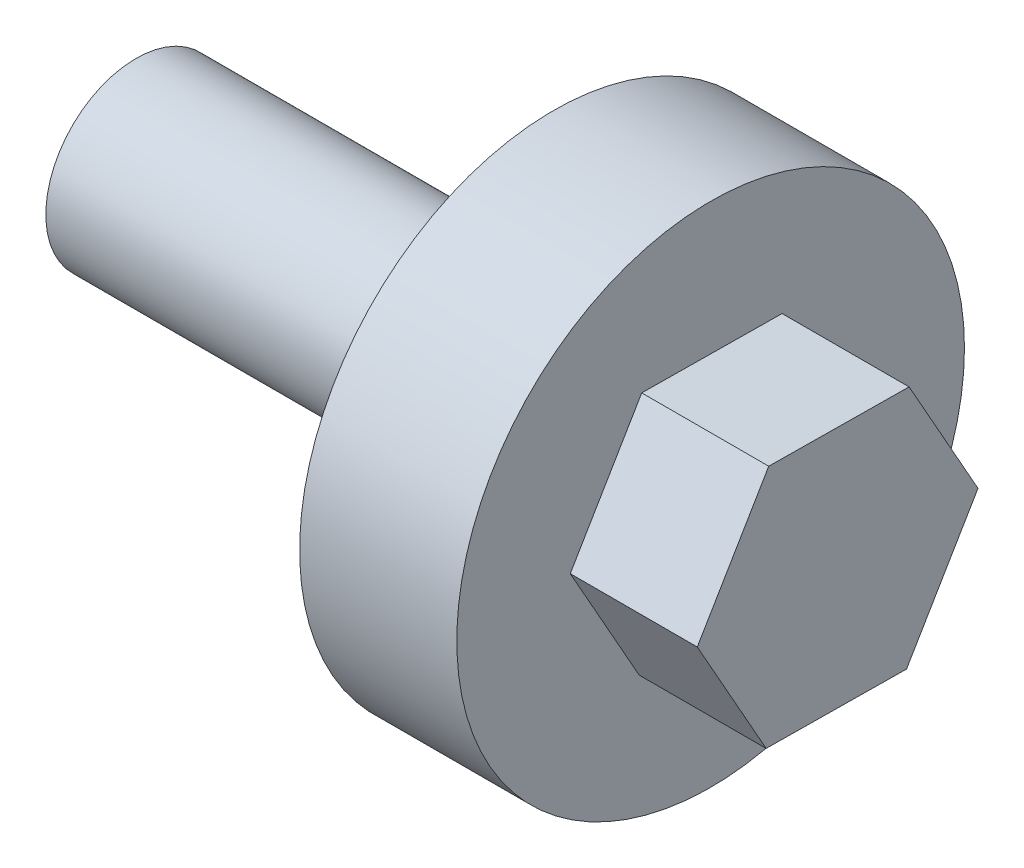
ISO-10303-21;
HEADER;
FILE_DESCRIPTION(('STEP AP214'),'2;1');
FILE_NAME('part.step','',(''),(''),'','','');
FILE_SCHEMA(('AUTOMOTIVE_DESIGN { 1 0 10303 214 1 1 1 1 }'));
ENDSEC;
DATA;
#1=APPLICATION_CONTEXT('core data for automotive mechanical design processes');
#2=APPLICATION_PROTOCOL_DEFINITION('international standard','automotive_design',2000,#1);
#3=PRODUCT_CONTEXT('',#1,'mechanical');
#4=PRODUCT('Part','Part','',(#3));
#5=PRODUCT_RELATED_PRODUCT_CATEGORY('part','',(#4));
#6=PRODUCT_DEFINITION_FORMATION('','',#4);
#7=PRODUCT_DEFINITION_CONTEXT('part definition',#1,'design');
#8=PRODUCT_DEFINITION('design','',#6,#7);
#9=PRODUCT_DEFINITION_SHAPE('','',#8);
#10=(LENGTH_UNIT() NAMED_UNIT(*) SI_UNIT(.MILLI.,.METRE.));
#11=(NAMED_UNIT(*) PLANE_ANGLE_UNIT() SI_UNIT($,.RADIAN.));
#12=(NAMED_UNIT(*) SI_UNIT($,.STERADIAN.) SOLID_ANGLE_UNIT());
#13=UNCERTAINTY_MEASURE_WITH_UNIT(LENGTH_MEASURE(1.E-05),#10,'distance_accuracy_value','');
#14=(GEOMETRIC_REPRESENTATION_CONTEXT(3) GLOBAL_UNCERTAINTY_ASSIGNED_CONTEXT((#13)) GLOBAL_UNIT_ASSIGNED_CONTEXT((#10,
#11,#12)) REPRESENTATION_CONTEXT('',''));
#15=CARTESIAN_POINT('',(0.,0.,0.));
#16=DIRECTION('',(0.,0.,1.));
#17=DIRECTION('',(1.,0.,0.));
#18=AXIS2_PLACEMENT_3D('',#15,#16,#17);
#19=CARTESIAN_POINT('',(0.,661.049224,75.529694));
#20=DIRECTION('',(1.,0.,0.));
#21=DIRECTION('',(0.,0.,-1.));
#22=AXIS2_PLACEMENT_3D('',#19,#20,#21);
#23=PLANE('',#22);
#24=CARTESIAN_POINT('',(0.,661.049224,75.529694));
#25=DIRECTION('',(1.,0.,0.));
#26=DIRECTION('',(0.,0.,-1.));
#27=AXIS2_PLACEMENT_3D('',#24,#25,#26);
#28=CIRCLE('',#27,46.334426);
#29=CARTESIAN_POINT('',(0.,661.049224,29.195268));
#30=VERTEX_POINT('',#29);
#31=EDGE_CURVE('E138',#30,#30,#28,.T.);
#32=ORIENTED_EDGE('',*,*,#31,.F.);
#33=EDGE_LOOP('',(#32));
#34=FACE_BOUND('',#33,.T.);
#35=CARTESIAN_POINT('',(0.,661.049224,75.529694));
#36=DIRECTION('',(1.,0.,0.));
#37=DIRECTION('',(0.,0.,-1.));
#38=AXIS2_PLACEMENT_3D('',#35,#36,#37);
#39=CIRCLE('',#38,16.4605447378752);
#40=CARTESIAN_POINT('',(0.,661.049224,59.0691492621248));
#41=VERTEX_POINT('',#40);
#42=EDGE_CURVE('E11',#41,#41,#39,.F.);
#43=ORIENTED_EDGE('',*,*,#42,.F.);
#44=EDGE_LOOP('',(#43));
#45=FACE_BOUND('',#44,.T.);
#46=ADVANCED_FACE('F33',(#34,#45),#23,.F.);
#47=CARTESIAN_POINT('',(28.68422,661.049224,75.529694));
#48=DIRECTION('',(1.,0.,0.));
#49=DIRECTION('',(0.,0.,-1.));
#50=AXIS2_PLACEMENT_3D('',#47,#48,#49);
#51=PLANE('',#50);
#52=CARTESIAN_POINT('',(28.68422,661.049224,75.529694));
#53=DIRECTION('',(1.,0.,0.));
#54=DIRECTION('',(0.,0.,-1.));
#55=AXIS2_PLACEMENT_3D('',#52,#53,#54);
#56=CIRCLE('',#55,46.334426);
#57=CARTESIAN_POINT('',(28.68422,661.049224,29.195268));
#58=VERTEX_POINT('',#57);
#59=EDGE_CURVE('E41',#58,#58,#56,.T.);
#60=ORIENTED_EDGE('',*,*,#59,.T.);
#61=EDGE_LOOP('',(#60));
#62=FACE_BOUND('',#61,.T.);
#63=DIRECTION('',(0.,-0.87124137043839,-0.49085484049425));
#64=VECTOR('',#63,1.);
#65=CARTESIAN_POINT('',(28.68422,661.318972,101.15042));
#66=LINE('',#65,#64);
#67=CARTESIAN_POINT('',(28.68422,661.318972,101.15042));
#68=VERTEX_POINT('',#67);
#69=CARTESIAN_POINT('',(28.68422,638.9958984206,88.57366562062));
#70=VERTEX_POINT('',#69);
#71=EDGE_CURVE('E120',#68,#70,#66,.T.);
#72=ORIENTED_EDGE('',*,*,#71,.F.);
#73=DIRECTION('',(0.,-0.860713446657774,0.509089739380489));
#74=VECTOR('',#73,1.);
#75=CARTESIAN_POINT('',(28.68422,683.372297579401,88.1064483793799));
#76=LINE('',#75,#74);
#77=CARTESIAN_POINT('',(28.68422,683.372297579401,88.1064483793799));
#78=VERTEX_POINT('',#77);
#79=EDGE_CURVE('E117',#78,#68,#76,.T.);
#80=ORIENTED_EDGE('',*,*,#79,.F.);
#81=DIRECTION('',(0.,0.0105279237806167,0.99994457987474));
#82=VECTOR('',#81,1.);
#83=CARTESIAN_POINT('',(28.68422,683.1025495794,62.4857223793799));
#84=LINE('',#83,#82);
#85=CARTESIAN_POINT('',(28.68422,683.1025495794,62.4857223793799));
#86=VERTEX_POINT('',#85);
#87=EDGE_CURVE('E76',#86,#78,#84,.T.);
#88=ORIENTED_EDGE('',*,*,#87,.F.);
#89=DIRECTION('',(0.,0.871241370438395,0.490854840494243));
#90=VECTOR('',#89,1.);
#91=CARTESIAN_POINT('',(28.68422,660.779476,49.9089680000001));
#92=LINE('',#91,#90);
#93=CARTESIAN_POINT('',(28.68422,660.779476,49.9089680000001));
#94=VERTEX_POINT('',#93);
#95=EDGE_CURVE('E126',#94,#86,#92,.T.);
#96=ORIENTED_EDGE('',*,*,#95,.F.);
#97=DIRECTION('',(0.,0.860713446657775,-0.509089739380488));
#98=VECTOR('',#97,1.);
#99=CARTESIAN_POINT('',(28.68422,638.726150420599,62.9529396206201));
#100=LINE('',#99,#98);
#101=CARTESIAN_POINT('',(28.68422,638.726150420599,62.9529396206201));
#102=VERTEX_POINT('',#101);
#103=EDGE_CURVE('E106',#102,#94,#100,.T.);
#104=ORIENTED_EDGE('',*,*,#103,.F.);
#105=DIRECTION('',(0.,-0.0105279237806211,-0.99994457987474));
#106=VECTOR('',#105,1.);
#107=CARTESIAN_POINT('',(28.68422,638.9958984206,88.57366562062));
#108=LINE('',#107,#106);
#109=EDGE_CURVE('E123',#70,#102,#108,.T.);
#110=ORIENTED_EDGE('',*,*,#109,.F.);
#111=EDGE_LOOP('',(#72,#80,#88,#96,#104,#110));
#112=FACE_BOUND('',#111,.T.);
#113=ADVANCED_FACE('F146',(#62,#112),#51,.T.);
#114=CARTESIAN_POINT('',(28.68422,661.049224,75.529694));
#115=DIRECTION('',(-1.,0.,0.));
#116=DIRECTION('',(0.,0.,1.));
#117=AXIS2_PLACEMENT_3D('',#114,#115,#116);
#118=CYLINDRICAL_SURFACE('',#117,46.334426);
#119=ORIENTED_EDGE('',*,*,#59,.F.);
#120=EDGE_LOOP('',(#119));
#121=FACE_BOUND('',#120,.T.);
#122=ORIENTED_EDGE('',*,*,#31,.T.);
#123=EDGE_LOOP('',(#122));
#124=FACE_BOUND('',#123,.T.);
#125=ADVANCED_FACE('F35',(#121,#124),#118,.T.);
#126=CARTESIAN_POINT('',(51.8668,683.372297579401,88.1064483793799));
#127=DIRECTION('',(0.,-0.509089739380489,-0.860713446657774));
#128=DIRECTION('',(0.,0.860713446657775,-0.509089739380489));
#129=AXIS2_PLACEMENT_3D('',#126,#127,#128);
#130=PLANE('',#129);
#131=ORIENTED_EDGE('',*,*,#79,.T.);
#132=DIRECTION('',(-1.,0.,0.));
#133=VECTOR('',#132,1.);
#134=CARTESIAN_POINT('',(51.8668,661.318972,101.15042));
#135=LINE('',#134,#133);
#136=CARTESIAN_POINT('',(51.8668,661.318972,101.15042));
#137=VERTEX_POINT('',#136);
#138=EDGE_CURVE('E136',#137,#68,#135,.T.);
#139=ORIENTED_EDGE('',*,*,#138,.F.);
#140=DIRECTION('',(0.,-0.860713446657774,0.509089739380489));
#141=VECTOR('',#140,1.);
#142=CARTESIAN_POINT('',(51.8668,683.372297579401,88.1064483793799));
#143=LINE('',#142,#141);
#144=CARTESIAN_POINT('',(51.8668,683.372297579401,88.1064483793799));
#145=VERTEX_POINT('',#144);
#146=EDGE_CURVE('E129',#145,#137,#143,.T.);
#147=ORIENTED_EDGE('',*,*,#146,.F.);
#148=DIRECTION('',(-1.,0.,0.));
#149=VECTOR('',#148,1.);
#150=CARTESIAN_POINT('',(51.8668,683.372297579401,88.1064483793799));
#151=LINE('',#150,#149);
#152=EDGE_CURVE('E113',#145,#78,#151,.T.);
#153=ORIENTED_EDGE('',*,*,#152,.T.);
#154=EDGE_LOOP('',(#131,#139,#147,#153));
#155=FACE_BOUND('',#154,.T.);
#156=ADVANCED_FACE('F177',(#155),#130,.F.);
#157=CARTESIAN_POINT('',(51.8668,661.318972,101.15042));
#158=DIRECTION('',(0.,0.49085484049425,-0.87124137043839));
#159=DIRECTION('',(0.,0.87124137043839,0.49085484049425));
#160=AXIS2_PLACEMENT_3D('',#157,#158,#159);
#161=PLANE('',#160);
#162=ORIENTED_EDGE('',*,*,#71,.T.);
#163=DIRECTION('',(-1.,0.,0.));
#164=VECTOR('',#163,1.);
#165=CARTESIAN_POINT('',(51.8668,638.9958984206,88.57366562062));
#166=LINE('',#165,#164);
#167=CARTESIAN_POINT('',(51.8668,638.9958984206,88.57366562062));
#168=VERTEX_POINT('',#167);
#169=EDGE_CURVE('E133',#168,#70,#166,.T.);
#170=ORIENTED_EDGE('',*,*,#169,.F.);
#171=DIRECTION('',(0.,-0.87124137043839,-0.49085484049425));
#172=VECTOR('',#171,1.);
#173=CARTESIAN_POINT('',(51.8668,661.318972,101.15042));
#174=LINE('',#173,#172);
#175=EDGE_CURVE('E84',#137,#168,#174,.T.);
#176=ORIENTED_EDGE('',*,*,#175,.F.);
#177=ORIENTED_EDGE('',*,*,#138,.T.);
#178=EDGE_LOOP('',(#162,#170,#176,#177));
#179=FACE_BOUND('',#178,.T.);
#180=ADVANCED_FACE('F173',(#179),#161,.F.);
#181=CARTESIAN_POINT('',(51.8668,638.9958984206,88.57366562062));
#182=DIRECTION('',(0.,0.999944579874739,-0.0105279237806211));
#183=DIRECTION('',(0.,0.0105279237806211,0.99994457987474));
#184=AXIS2_PLACEMENT_3D('',#181,#182,#183);
#185=PLANE('',#184);
#186=ORIENTED_EDGE('',*,*,#109,.T.);
#187=DIRECTION('',(-1.,0.,0.));
#188=VECTOR('',#187,1.);
#189=CARTESIAN_POINT('',(51.8668,638.726150420599,62.9529396206201));
#190=LINE('',#189,#188);
#191=CARTESIAN_POINT('',(51.8668,638.726150420599,62.9529396206201));
#192=VERTEX_POINT('',#191);
#193=EDGE_CURVE('E109',#192,#102,#190,.T.);
#194=ORIENTED_EDGE('',*,*,#193,.F.);
#195=DIRECTION('',(0.,-0.0105279237806211,-0.99994457987474));
#196=VECTOR('',#195,1.);
#197=CARTESIAN_POINT('',(51.8668,638.9958984206,88.57366562062));
#198=LINE('',#197,#196);
#199=EDGE_CURVE('E97',#168,#192,#198,.T.);
#200=ORIENTED_EDGE('',*,*,#199,.F.);
#201=ORIENTED_EDGE('',*,*,#169,.T.);
#202=EDGE_LOOP('',(#186,#194,#200,#201));
#203=FACE_BOUND('',#202,.T.);
#204=ADVANCED_FACE('F170',(#203),#185,.F.);
#205=CARTESIAN_POINT('',(51.8668,638.726150420599,62.9529396206201));
#206=DIRECTION('',(0.,0.509089739380488,0.860713446657775));
#207=DIRECTION('',(0.,-0.860713446657775,0.509089739380488));
#208=AXIS2_PLACEMENT_3D('',#205,#206,#207);
#209=PLANE('',#208);
#210=ORIENTED_EDGE('',*,*,#103,.T.);
#211=DIRECTION('',(-1.,0.,0.));
#212=VECTOR('',#211,1.);
#213=CARTESIAN_POINT('',(51.8668,660.779476,49.9089680000001));
#214=LINE('',#213,#212);
#215=CARTESIAN_POINT('',(51.8668,660.779476,49.9089680000001));
#216=VERTEX_POINT('',#215);
#217=EDGE_CURVE('E103',#216,#94,#214,.T.);
#218=ORIENTED_EDGE('',*,*,#217,.F.);
#219=DIRECTION('',(0.,0.860713446657775,-0.509089739380488));
#220=VECTOR('',#219,1.);
#221=CARTESIAN_POINT('',(51.8668,638.726150420599,62.9529396206201));
#222=LINE('',#221,#220);
#223=EDGE_CURVE('E91',#192,#216,#222,.T.);
#224=ORIENTED_EDGE('',*,*,#223,.F.);
#225=ORIENTED_EDGE('',*,*,#193,.T.);
#226=EDGE_LOOP('',(#210,#218,#224,#225));
#227=FACE_BOUND('',#226,.T.);
#228=ADVANCED_FACE('F104',(#227),#209,.F.);
#229=CARTESIAN_POINT('',(51.8668,660.779476,49.9089680000001));
#230=DIRECTION('',(0.,-0.490854840494243,0.871241370438394));
#231=DIRECTION('',(0.,-0.871241370438395,-0.490854840494243));
#232=AXIS2_PLACEMENT_3D('',#229,#230,#231);
#233=PLANE('',#232);
#234=ORIENTED_EDGE('',*,*,#95,.T.);
#235=DIRECTION('',(-1.,0.,0.));
#236=VECTOR('',#235,1.);
#237=CARTESIAN_POINT('',(51.8668,683.1025495794,62.4857223793799));
#238=LINE('',#237,#236);
#239=CARTESIAN_POINT('',(51.8668,683.1025495794,62.4857223793799));
#240=VERTEX_POINT('',#239);
#241=EDGE_CURVE('E48',#240,#86,#238,.T.);
#242=ORIENTED_EDGE('',*,*,#241,.F.);
#243=DIRECTION('',(0.,0.871241370438395,0.490854840494243));
#244=VECTOR('',#243,1.);
#245=CARTESIAN_POINT('',(51.8668,660.779476,49.9089680000001));
#246=LINE('',#245,#244);
#247=EDGE_CURVE('E95',#216,#240,#246,.T.);
#248=ORIENTED_EDGE('',*,*,#247,.F.);
#249=ORIENTED_EDGE('',*,*,#217,.T.);
#250=EDGE_LOOP('',(#234,#242,#248,#249));
#251=FACE_BOUND('',#250,.T.);
#252=ADVANCED_FACE('F111',(#251),#233,.F.);
#253=CARTESIAN_POINT('',(51.8668,683.1025495794,62.4857223793799));
#254=DIRECTION('',(0.,-0.99994457987474,0.0105279237806167));
#255=DIRECTION('',(0.,-0.0105279237806167,-0.99994457987474));
#256=AXIS2_PLACEMENT_3D('',#253,#254,#255);
#257=PLANE('',#256);
#258=ORIENTED_EDGE('',*,*,#87,.T.);
#259=ORIENTED_EDGE('',*,*,#152,.F.);
#260=DIRECTION('',(0.,0.0105279237806167,0.99994457987474));
#261=VECTOR('',#260,1.);
#262=CARTESIAN_POINT('',(51.8668,683.1025495794,62.4857223793799));
#263=LINE('',#262,#261);
#264=EDGE_CURVE('E56',#240,#145,#263,.T.);
#265=ORIENTED_EDGE('',*,*,#264,.F.);
#266=ORIENTED_EDGE('',*,*,#241,.T.);
#267=EDGE_LOOP('',(#258,#259,#265,#266));
#268=FACE_BOUND('',#267,.T.);
#269=ADVANCED_FACE('F160',(#268),#257,.F.);
#270=CARTESIAN_POINT('',(51.8668,0.,0.));
#271=DIRECTION('',(1.,0.,0.));
#272=DIRECTION('',(0.,0.,-1.));
#273=AXIS2_PLACEMENT_3D('',#270,#271,#272);
#274=PLANE('',#273);
#275=ORIENTED_EDGE('',*,*,#146,.T.);
#276=ORIENTED_EDGE('',*,*,#175,.T.);
#277=ORIENTED_EDGE('',*,*,#199,.T.);
#278=ORIENTED_EDGE('',*,*,#223,.T.);
#279=ORIENTED_EDGE('',*,*,#247,.T.);
#280=ORIENTED_EDGE('',*,*,#264,.T.);
#281=EDGE_LOOP('',(#275,#276,#277,#278,#279,#280));
#282=FACE_BOUND('',#281,.T.);
#283=ADVANCED_FACE('F93',(#282),#274,.T.);
#284=CARTESIAN_POINT('',(-76.2,661.049224,75.529694));
#285=DIRECTION('',(1.,0.,0.));
#286=DIRECTION('',(0.,0.,-1.));
#287=AXIS2_PLACEMENT_3D('',#284,#285,#286);
#288=CYLINDRICAL_SURFACE('',#287,16.4605447378752);
#289=CARTESIAN_POINT('',(-76.2,661.049224,75.529694));
#290=DIRECTION('',(-1.,0.,0.));
#291=DIRECTION('',(0.,0.,1.));
#292=AXIS2_PLACEMENT_3D('',#289,#290,#291);
#293=CIRCLE('',#292,16.4605447378752);
#294=CARTESIAN_POINT('',(-76.2,661.049224,59.0691492621248));
#295=VERTEX_POINT('',#294);
#296=EDGE_CURVE('E121',#295,#295,#293,.T.);
#297=CARTESIAN_POINT('',(-76.2,661.049224,59.0691492621248));
#298=CARTESIAN_POINT('',(-75.40625,661.049224,59.0691492621248));
#299=CARTESIAN_POINT('',(-74.6125,661.049224,59.0691492621248));
#300=CARTESIAN_POINT('',(-73.025,661.049224,59.0691492621248));
#301=CARTESIAN_POINT('',(-72.23125,661.049224,59.0691492621248));
#302=CARTESIAN_POINT('',(-70.64375,661.049224,59.0691492621248));
#303=CARTESIAN_POINT('',(-69.85,661.049224,59.0691492621248));
#304=CARTESIAN_POINT('',(-68.2625,661.049224,59.0691492621248));
#305=CARTESIAN_POINT('',(-67.46875,661.049224,59.0691492621248));
#306=CARTESIAN_POINT('',(-65.88125,661.049224,59.0691492621248));
#307=CARTESIAN_POINT('',(-65.0875,661.049224,59.0691492621248));
#308=CARTESIAN_POINT('',(-63.5,661.049224,59.0691492621248));
#309=CARTESIAN_POINT('',(-62.70625,661.049224,59.0691492621248));
#310=CARTESIAN_POINT('',(-61.11875,661.049224,59.0691492621248));
#311=CARTESIAN_POINT('',(-60.325,661.049224,59.0691492621248));
#312=CARTESIAN_POINT('',(-58.7375,661.049224,59.0691492621248));
#313=CARTESIAN_POINT('',(-57.94375,661.049224,59.0691492621248));
#314=CARTESIAN_POINT('',(-56.35625,661.049224,59.0691492621248));
#315=CARTESIAN_POINT('',(-55.5625,661.049224,59.0691492621248));
#316=CARTESIAN_POINT('',(-53.975,661.049224,59.0691492621248));
#317=CARTESIAN_POINT('',(-53.18125,661.049224,59.0691492621248));
#318=CARTESIAN_POINT('',(-51.59375,661.049224,59.0691492621248));
#319=CARTESIAN_POINT('',(-50.8,661.049224,59.0691492621248));
#320=CARTESIAN_POINT('',(-49.2125,661.049224,59.0691492621248));
#321=CARTESIAN_POINT('',(-48.41875,661.049224,59.0691492621248));
#322=CARTESIAN_POINT('',(-46.83125,661.049224,59.0691492621248));
#323=CARTESIAN_POINT('',(-46.0375,661.049224,59.0691492621248));
#324=CARTESIAN_POINT('',(-44.45,661.049224,59.0691492621248));
#325=CARTESIAN_POINT('',(-43.65625,661.049224,59.0691492621248));
#326=CARTESIAN_POINT('',(-42.06875,661.049224,59.0691492621248));
#327=CARTESIAN_POINT('',(-41.275,661.049224,59.0691492621248));
#328=CARTESIAN_POINT('',(-39.6875,661.049224,59.0691492621248));
#329=CARTESIAN_POINT('',(-38.89375,661.049224,59.0691492621248));
#330=CARTESIAN_POINT('',(-37.30625,661.049224,59.0691492621248));
#331=CARTESIAN_POINT('',(-36.5125,661.049224,59.0691492621248));
#332=CARTESIAN_POINT('',(-34.925,661.049224,59.0691492621248));
#333=CARTESIAN_POINT('',(-34.13125,661.049224,59.0691492621248));
#334=CARTESIAN_POINT('',(-32.54375,661.049224,59.0691492621248));
#335=CARTESIAN_POINT('',(-31.75,661.049224,59.0691492621248));
#336=CARTESIAN_POINT('',(-30.1625,661.049224,59.0691492621248));
#337=CARTESIAN_POINT('',(-29.36875,661.049224,59.0691492621248));
#338=CARTESIAN_POINT('',(-27.78125,661.049224,59.0691492621248));
#339=CARTESIAN_POINT('',(-26.9875,661.049224,59.0691492621248));
#340=CARTESIAN_POINT('',(-25.4,661.049224,59.0691492621248));
#341=CARTESIAN_POINT('',(-24.60625,661.049224,59.0691492621248));
#342=CARTESIAN_POINT('',(-23.01875,661.049224,59.0691492621248));
#343=CARTESIAN_POINT('',(-22.225,661.049224,59.0691492621248));
#344=CARTESIAN_POINT('',(-20.6375,661.049224,59.0691492621248));
#345=CARTESIAN_POINT('',(-19.84375,661.049224,59.0691492621248));
#346=CARTESIAN_POINT('',(-18.25625,661.049224,59.0691492621248));
#347=CARTESIAN_POINT('',(-17.4625,661.049224,59.0691492621248));
#348=CARTESIAN_POINT('',(-15.875,661.049224,59.0691492621248));
#349=CARTESIAN_POINT('',(-15.08125,661.049224,59.0691492621248));
#350=CARTESIAN_POINT('',(-13.49375,661.049224,59.0691492621248));
#351=CARTESIAN_POINT('',(-12.7,661.049224,59.0691492621248));
#352=CARTESIAN_POINT('',(-11.1125,661.049224,59.0691492621248));
#353=CARTESIAN_POINT('',(-10.31875,661.049224,59.0691492621248));
#354=CARTESIAN_POINT('',(-8.73125,661.049224,59.0691492621248));
#355=CARTESIAN_POINT('',(-7.93750000000001,661.049224,59.0691492621248));
#356=CARTESIAN_POINT('',(-6.35,661.049224,59.0691492621248));
#357=CARTESIAN_POINT('',(-5.55625,661.049224,59.0691492621248));
#358=CARTESIAN_POINT('',(-3.96875,661.049224,59.0691492621248));
#359=CARTESIAN_POINT('',(-3.175,661.049224,59.0691492621248));
#360=CARTESIAN_POINT('',(-1.5875,661.049224,59.0691492621248));
#361=CARTESIAN_POINT('',(-0.793750000000001,661.049224,59.0691492621248));
#362=CARTESIAN_POINT('',(0.,661.049224,59.0691492621248));
#363=B_SPLINE_CURVE_WITH_KNOTS('',3,(#297,#298,#299,#300,#301,#302,#303,#304,#305,#306,#307,
#308,#309,#310,#311,#312,#313,#314,#315,#316,#317,#318,#319,#320,#321,#322,#323,#324,#325,#326,
#327,#328,#329,#330,#331,#332,#333,#334,#335,#336,#337,#338,#339,#340,#341,#342,#343,#344,#345,
#346,#347,#348,#349,#350,#351,#352,#353,#354,#355,#356,#357,#358,#359,#360,#361,#362),
.UNSPECIFIED.,.F.,.F.,(4,2,2,2,2,2,2,2,2,2,2,2,2,2,2,2,2,2,2,2,2,2,2,2,2,2,2,2,2,2,2,2,4),(0.,
2.38124999999999,4.76249999999999,7.14374999999999,9.52499999999999,11.90625,14.2875,16.66875,
19.05,21.43125,23.8125,26.19375,28.575,30.95625,33.3375,35.71875,38.1,40.48125,42.8625,45.24375,
47.625,50.00625,52.3875,54.76875,57.15,59.53125,61.9125,64.29375,66.675,69.05625,71.4375,
73.81875,76.2),.UNSPECIFIED.);
#364=EDGE_CURVE('BSEAM149',#295,#41,#363,.T.);
#365=ORIENTED_EDGE('',*,*,#296,.F.);
#366=ORIENTED_EDGE('',*,*,#42,.T.);
#367=ORIENTED_EDGE('',*,*,#364,.T.);
#368=ORIENTED_EDGE('',*,*,#364,.F.);
#369=EDGE_LOOP('',(#365,#367,#366,#368));
#370=FACE_BOUND('',#369,.T.);
#371=ADVANCED_FACE('F149',(#370),#288,.T.);
#372=CARTESIAN_POINT('',(-76.2,661.049224,75.529694));
#373=DIRECTION('',(-1.,0.,0.));
#374=DIRECTION('',(0.,0.,1.));
#375=AXIS2_PLACEMENT_3D('',#372,#373,#374);
#376=PLANE('',#375);
#377=ORIENTED_EDGE('',*,*,#296,.T.);
#378=EDGE_LOOP('',(#377));
#379=FACE_BOUND('',#378,.T.);
#380=ADVANCED_FACE('F151',(#379),#376,.T.);
#381=CLOSED_SHELL('',(#46,#113,#125,#156,#180,#204,#228,#252,#269,#283,#371,#380));
#382=MANIFOLD_SOLID_BREP('B2',#381);
#383=ADVANCED_BREP_SHAPE_REPRESENTATION('',(#18,#382),#14);
#384=SHAPE_DEFINITION_REPRESENTATION(#9,#383);
ENDSEC;
END-ISO-10303-21;
